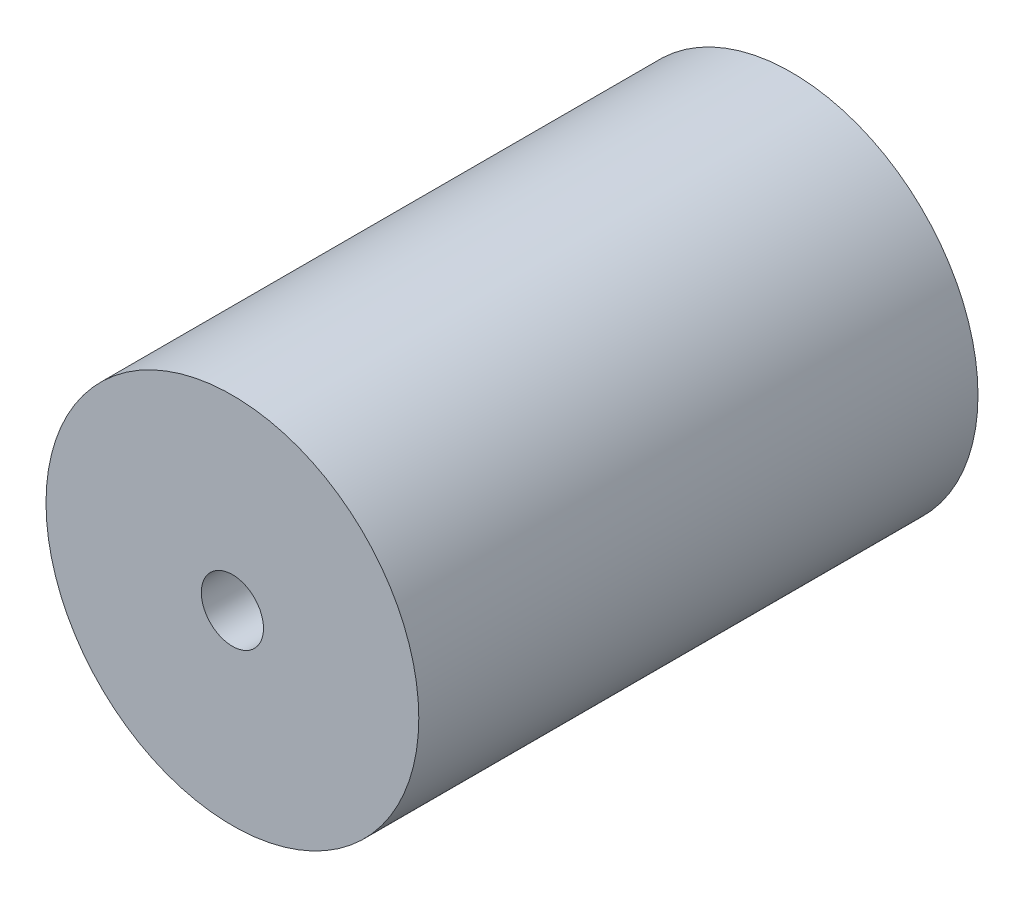
ISO-10303-21;
HEADER;
FILE_DESCRIPTION(('STEP AP214'),'2;1');
FILE_NAME('part.step','',(''),(''),'','','');
FILE_SCHEMA(('AUTOMOTIVE_DESIGN { 1 0 10303 214 1 1 1 1 }'));
ENDSEC;
DATA;
#1=APPLICATION_CONTEXT('core data for automotive mechanical design processes');
#2=APPLICATION_PROTOCOL_DEFINITION('international standard','automotive_design',2000,#1);
#3=PRODUCT_CONTEXT('',#1,'mechanical');
#4=PRODUCT('Part','Part','',(#3));
#5=PRODUCT_RELATED_PRODUCT_CATEGORY('part','',(#4));
#6=PRODUCT_DEFINITION_FORMATION('','',#4);
#7=PRODUCT_DEFINITION_CONTEXT('part definition',#1,'design');
#8=PRODUCT_DEFINITION('design','',#6,#7);
#9=PRODUCT_DEFINITION_SHAPE('','',#8);
#10=(LENGTH_UNIT() NAMED_UNIT(*) SI_UNIT(.MILLI.,.METRE.));
#11=(NAMED_UNIT(*) PLANE_ANGLE_UNIT() SI_UNIT($,.RADIAN.));
#12=(NAMED_UNIT(*) SI_UNIT($,.STERADIAN.) SOLID_ANGLE_UNIT());
#13=UNCERTAINTY_MEASURE_WITH_UNIT(LENGTH_MEASURE(1.E-05),#10,'distance_accuracy_value','');
#14=(GEOMETRIC_REPRESENTATION_CONTEXT(3) GLOBAL_UNCERTAINTY_ASSIGNED_CONTEXT((#13)) GLOBAL_UNIT_ASSIGNED_CONTEXT((#10,
#11,#12)) REPRESENTATION_CONTEXT('',''));
#15=CARTESIAN_POINT('',(0.,0.,0.));
#16=DIRECTION('',(0.,0.,1.));
#17=DIRECTION('',(1.,0.,0.));
#18=AXIS2_PLACEMENT_3D('',#15,#16,#17);
#19=CARTESIAN_POINT('',(0.,0.,28.575));
#20=DIRECTION('',(0.,0.,1.));
#21=DIRECTION('',(1.,0.,0.));
#22=AXIS2_PLACEMENT_3D('',#19,#20,#21);
#23=PLANE('',#22);
#24=CARTESIAN_POINT('',(0.,0.,28.575));
#25=DIRECTION('',(0.,0.,1.));
#26=DIRECTION('',(1.,0.,0.));
#27=AXIS2_PLACEMENT_3D('',#24,#25,#26);
#28=CIRCLE('',#27,9.525);
#29=CARTESIAN_POINT('',(9.525,0.,28.575));
#30=VERTEX_POINT('',#29);
#31=EDGE_CURVE('E10',#30,#30,#28,.T.);
#32=ORIENTED_EDGE('',*,*,#31,.T.);
#33=EDGE_LOOP('',(#32));
#34=FACE_BOUND('',#33,.T.);
#35=CARTESIAN_POINT('',(0.,0.,28.575));
#36=DIRECTION('',(0.,0.,1.));
#37=DIRECTION('',(1.,0.,0.));
#38=AXIS2_PLACEMENT_3D('',#35,#36,#37);
#39=CIRCLE('',#38,1.5875);
#40=CARTESIAN_POINT('',(1.5875,0.,28.575));
#41=VERTEX_POINT('',#40);
#42=EDGE_CURVE('E26',#41,#41,#39,.T.);
#43=ORIENTED_EDGE('',*,*,#42,.F.);
#44=EDGE_LOOP('',(#43));
#45=FACE_BOUND('',#44,.T.);
#46=ADVANCED_FACE('F15',(#34,#45),#23,.T.);
#47=CARTESIAN_POINT('',(0.,0.,0.));
#48=DIRECTION('',(0.,0.,1.));
#49=DIRECTION('',(1.,0.,0.));
#50=AXIS2_PLACEMENT_3D('',#47,#48,#49);
#51=PLANE('',#50);
#52=CARTESIAN_POINT('',(0.,0.,0.));
#53=DIRECTION('',(0.,0.,1.));
#54=DIRECTION('',(1.,0.,0.));
#55=AXIS2_PLACEMENT_3D('',#52,#53,#54);
#56=CIRCLE('',#55,9.525);
#57=CARTESIAN_POINT('',(9.525,0.,0.));
#58=VERTEX_POINT('',#57);
#59=EDGE_CURVE('E19',#58,#58,#56,.T.);
#60=ORIENTED_EDGE('',*,*,#59,.F.);
#61=EDGE_LOOP('',(#60));
#62=FACE_BOUND('',#61,.T.);
#63=CARTESIAN_POINT('',(0.,0.,0.));
#64=DIRECTION('',(0.,0.,1.));
#65=DIRECTION('',(1.,0.,0.));
#66=AXIS2_PLACEMENT_3D('',#63,#64,#65);
#67=CIRCLE('',#66,1.5875);
#68=CARTESIAN_POINT('',(1.5875,0.,0.));
#69=VERTEX_POINT('',#68);
#70=EDGE_CURVE('E28',#69,#69,#67,.T.);
#71=ORIENTED_EDGE('',*,*,#70,.T.);
#72=EDGE_LOOP('',(#71));
#73=FACE_BOUND('',#72,.T.);
#74=ADVANCED_FACE('F38',(#62,#73),#51,.F.);
#75=CARTESIAN_POINT('',(0.,0.,28.575));
#76=DIRECTION('',(0.,0.,-1.));
#77=DIRECTION('',(-1.,0.,0.));
#78=AXIS2_PLACEMENT_3D('',#75,#76,#77);
#79=CYLINDRICAL_SURFACE('',#78,9.525);
#80=ORIENTED_EDGE('',*,*,#31,.F.);
#81=EDGE_LOOP('',(#80));
#82=FACE_BOUND('',#81,.T.);
#83=ORIENTED_EDGE('',*,*,#59,.T.);
#84=EDGE_LOOP('',(#83));
#85=FACE_BOUND('',#84,.T.);
#86=ADVANCED_FACE('F17',(#82,#85),#79,.T.);
#87=CARTESIAN_POINT('',(0.,0.,28.575));
#88=DIRECTION('',(0.,0.,-1.));
#89=DIRECTION('',(-1.,0.,0.));
#90=AXIS2_PLACEMENT_3D('',#87,#88,#89);
#91=CYLINDRICAL_SURFACE('',#90,1.5875);
#92=ORIENTED_EDGE('',*,*,#42,.T.);
#93=EDGE_LOOP('',(#92));
#94=FACE_BOUND('',#93,.T.);
#95=ORIENTED_EDGE('',*,*,#70,.F.);
#96=EDGE_LOOP('',(#95));
#97=FACE_BOUND('',#96,.T.);
#98=ADVANCED_FACE('F34',(#94,#97),#91,.F.);
#99=CLOSED_SHELL('',(#46,#74,#86,#98));
#100=MANIFOLD_SOLID_BREP('B1',#99);
#101=ADVANCED_BREP_SHAPE_REPRESENTATION('',(#18,#100),#14);
#102=SHAPE_DEFINITION_REPRESENTATION(#9,#101);
ENDSEC;
END-ISO-10303-21;
